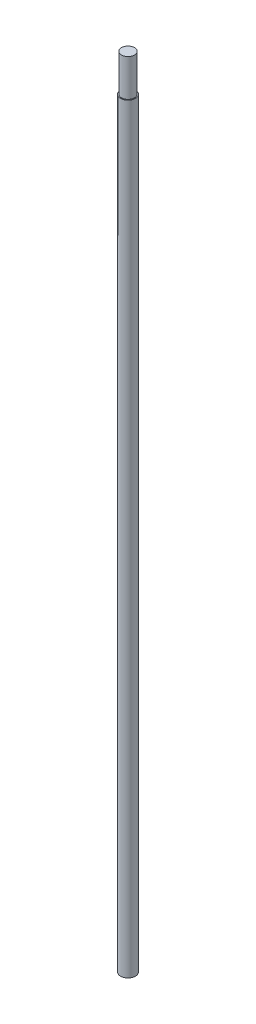
ISO-10303-21;
HEADER;
FILE_DESCRIPTION(('STEP AP214'),'2;1');
FILE_NAME('part.step','',(''),(''),'','','');
FILE_SCHEMA(('AUTOMOTIVE_DESIGN { 1 0 10303 214 1 1 1 1 }'));
ENDSEC;
DATA;
#1=APPLICATION_CONTEXT('core data for automotive mechanical design processes');
#2=APPLICATION_PROTOCOL_DEFINITION('international standard','automotive_design',2000,#1);
#3=PRODUCT_CONTEXT('',#1,'mechanical');
#4=PRODUCT('Part','Part','',(#3));
#5=PRODUCT_RELATED_PRODUCT_CATEGORY('part','',(#4));
#6=PRODUCT_DEFINITION_FORMATION('','',#4);
#7=PRODUCT_DEFINITION_CONTEXT('part definition',#1,'design');
#8=PRODUCT_DEFINITION('design','',#6,#7);
#9=PRODUCT_DEFINITION_SHAPE('','',#8);
#10=(LENGTH_UNIT() NAMED_UNIT(*) SI_UNIT(.MILLI.,.METRE.));
#11=(NAMED_UNIT(*) PLANE_ANGLE_UNIT() SI_UNIT($,.RADIAN.));
#12=(NAMED_UNIT(*) SI_UNIT($,.STERADIAN.) SOLID_ANGLE_UNIT());
#13=UNCERTAINTY_MEASURE_WITH_UNIT(LENGTH_MEASURE(1.E-05),#10,'distance_accuracy_value','');
#14=(GEOMETRIC_REPRESENTATION_CONTEXT(3) GLOBAL_UNCERTAINTY_ASSIGNED_CONTEXT((#13)) GLOBAL_UNIT_ASSIGNED_CONTEXT((#10,
#11,#12)) REPRESENTATION_CONTEXT('',''));
#15=CARTESIAN_POINT('',(0.,0.,0.));
#16=DIRECTION('',(0.,0.,1.));
#17=DIRECTION('',(1.,0.,0.));
#18=AXIS2_PLACEMENT_3D('',#15,#16,#17);
#19=CARTESIAN_POINT('',(0.,410.,0.));
#20=DIRECTION('',(0.,-1.,0.));
#21=DIRECTION('',(0.,0.,-1.));
#22=AXIS2_PLACEMENT_3D('',#19,#20,#21);
#23=CYLINDRICAL_SURFACE('',#22,4.);
#24=CARTESIAN_POINT('',(0.,410.,0.));
#25=DIRECTION('',(0.,1.,0.));
#26=DIRECTION('',(0.,0.,1.));
#27=AXIS2_PLACEMENT_3D('',#24,#25,#26);
#28=CIRCLE('',#27,4.);
#29=CARTESIAN_POINT('',(0.,410.,-4.));
#30=VERTEX_POINT('',#29);
#31=EDGE_CURVE('E44',#30,#30,#28,.T.);
#32=CARTESIAN_POINT('',(0.,0.,0.));
#33=DIRECTION('',(0.,1.,0.));
#34=DIRECTION('',(0.,0.,1.));
#35=AXIS2_PLACEMENT_3D('',#32,#33,#34);
#36=CIRCLE('',#35,4.);
#37=CARTESIAN_POINT('',(0.,0.,-4.));
#38=VERTEX_POINT('',#37);
#39=EDGE_CURVE('E40',#38,#38,#36,.T.);
#40=CARTESIAN_POINT('',(0.,410.,-4.));
#41=CARTESIAN_POINT('',(0.,405.729166666667,-4.));
#42=CARTESIAN_POINT('',(0.,401.458333333333,-4.));
#43=CARTESIAN_POINT('',(0.,392.916666666667,-4.));
#44=CARTESIAN_POINT('',(0.,388.645833333333,-4.));
#45=CARTESIAN_POINT('',(0.,380.104166666667,-4.));
#46=CARTESIAN_POINT('',(0.,375.833333333333,-4.));
#47=CARTESIAN_POINT('',(0.,367.291666666667,-4.));
#48=CARTESIAN_POINT('',(0.,363.020833333333,-4.));
#49=CARTESIAN_POINT('',(0.,354.479166666667,-4.));
#50=CARTESIAN_POINT('',(0.,350.208333333333,-4.));
#51=CARTESIAN_POINT('',(0.,341.666666666667,-4.));
#52=CARTESIAN_POINT('',(0.,337.395833333333,-4.));
#53=CARTESIAN_POINT('',(0.,328.854166666667,-4.));
#54=CARTESIAN_POINT('',(0.,324.583333333333,-4.));
#55=CARTESIAN_POINT('',(0.,316.041666666667,-4.));
#56=CARTESIAN_POINT('',(0.,311.770833333333,-4.));
#57=CARTESIAN_POINT('',(0.,303.229166666667,-4.));
#58=CARTESIAN_POINT('',(0.,298.958333333333,-4.));
#59=CARTESIAN_POINT('',(0.,290.416666666667,-4.));
#60=CARTESIAN_POINT('',(0.,286.145833333333,-4.));
#61=CARTESIAN_POINT('',(0.,277.604166666667,-4.));
#62=CARTESIAN_POINT('',(0.,273.333333333333,-4.));
#63=CARTESIAN_POINT('',(0.,264.791666666667,-4.));
#64=CARTESIAN_POINT('',(0.,260.520833333333,-4.));
#65=CARTESIAN_POINT('',(0.,251.979166666667,-4.));
#66=CARTESIAN_POINT('',(0.,247.708333333333,-4.));
#67=CARTESIAN_POINT('',(0.,239.166666666667,-4.));
#68=CARTESIAN_POINT('',(0.,234.895833333333,-4.));
#69=CARTESIAN_POINT('',(0.,226.354166666667,-4.));
#70=CARTESIAN_POINT('',(0.,222.083333333333,-4.));
#71=CARTESIAN_POINT('',(0.,213.541666666667,-4.));
#72=CARTESIAN_POINT('',(0.,209.270833333333,-4.));
#73=CARTESIAN_POINT('',(0.,200.729166666667,-4.));
#74=CARTESIAN_POINT('',(0.,196.458333333333,-4.));
#75=CARTESIAN_POINT('',(0.,187.916666666667,-4.));
#76=CARTESIAN_POINT('',(0.,183.645833333333,-4.));
#77=CARTESIAN_POINT('',(0.,175.104166666667,-4.));
#78=CARTESIAN_POINT('',(0.,170.833333333333,-4.));
#79=CARTESIAN_POINT('',(0.,162.291666666667,-4.));
#80=CARTESIAN_POINT('',(0.,158.020833333333,-4.));
#81=CARTESIAN_POINT('',(0.,149.479166666667,-4.));
#82=CARTESIAN_POINT('',(0.,145.208333333333,-4.));
#83=CARTESIAN_POINT('',(0.,136.666666666667,-4.));
#84=CARTESIAN_POINT('',(0.,132.395833333333,-4.));
#85=CARTESIAN_POINT('',(0.,123.854166666667,-4.));
#86=CARTESIAN_POINT('',(0.,119.583333333333,-4.));
#87=CARTESIAN_POINT('',(0.,111.041666666667,-4.));
#88=CARTESIAN_POINT('',(0.,106.770833333333,-4.));
#89=CARTESIAN_POINT('',(0.,98.2291666666667,-4.));
#90=CARTESIAN_POINT('',(0.,93.9583333333334,-4.));
#91=CARTESIAN_POINT('',(0.,85.4166666666667,-4.));
#92=CARTESIAN_POINT('',(0.,81.1458333333334,-4.));
#93=CARTESIAN_POINT('',(0.,72.6041666666667,-4.));
#94=CARTESIAN_POINT('',(0.,68.3333333333334,-4.));
#95=CARTESIAN_POINT('',(0.,59.7916666666667,-4.));
#96=CARTESIAN_POINT('',(0.,55.5208333333333,-4.));
#97=CARTESIAN_POINT('',(0.,46.9791666666667,-4.));
#98=CARTESIAN_POINT('',(0.,42.7083333333333,-4.));
#99=CARTESIAN_POINT('',(0.,34.1666666666667,-4.));
#100=CARTESIAN_POINT('',(0.,29.8958333333333,-4.));
#101=CARTESIAN_POINT('',(0.,21.3541666666667,-4.));
#102=CARTESIAN_POINT('',(0.,17.0833333333333,-4.));
#103=CARTESIAN_POINT('',(0.,8.54166666666667,-4.));
#104=CARTESIAN_POINT('',(0.,4.27083333333333,-4.));
#105=CARTESIAN_POINT('',(0.,0.,-4.));
#106=B_SPLINE_CURVE_WITH_KNOTS('',3,(#40,#41,#42,#43,#44,#45,#46,#47,#48,#49,#50,#51,#52,#53,
#54,#55,#56,#57,#58,#59,#60,#61,#62,#63,#64,#65,#66,#67,#68,#69,#70,#71,#72,#73,#74,#75,#76,#77,
#78,#79,#80,#81,#82,#83,#84,#85,#86,#87,#88,#89,#90,#91,#92,#93,#94,#95,#96,#97,#98,#99,#100,
#101,#102,#103,#104,#105),.UNSPECIFIED.,.F.,.F.,(4,2,2,2,2,2,2,2,2,2,2,2,2,2,2,2,2,2,2,2,2,2,2,
2,2,2,2,2,2,2,2,2,4),(0.,12.8125,25.625,38.4375,51.25,64.0625,76.875,89.6875,102.5,115.3125,
128.125,140.9375,153.75,166.5625,179.375,192.1875,205.,217.8125,230.625,243.4375,256.25,
269.0625,281.875,294.6875,307.5,320.3125,333.125,345.9375,358.75,371.5625,384.375,397.1875,
410.),.UNSPECIFIED.);
#107=EDGE_CURVE('BSEAM37',#30,#38,#106,.T.);
#108=ORIENTED_EDGE('',*,*,#31,.F.);
#109=ORIENTED_EDGE('',*,*,#39,.T.);
#110=ORIENTED_EDGE('',*,*,#107,.T.);
#111=ORIENTED_EDGE('',*,*,#107,.F.);
#112=EDGE_LOOP('',(#108,#110,#109,#111));
#113=FACE_BOUND('',#112,.T.);
#114=ADVANCED_FACE('F37',(#113),#23,.T.);
#115=CARTESIAN_POINT('',(0.,410.,0.));
#116=DIRECTION('',(0.,1.,0.));
#117=DIRECTION('',(0.,0.,1.));
#118=AXIS2_PLACEMENT_3D('',#115,#116,#117);
#119=PLANE('',#118);
#120=CARTESIAN_POINT('',(0.,410.,0.));
#121=DIRECTION('',(0.,1.,0.));
#122=DIRECTION('',(0.,0.,1.));
#123=AXIS2_PLACEMENT_3D('',#120,#121,#122);
#124=CIRCLE('',#123,3.5);
#125=CARTESIAN_POINT('',(0.,410.,3.5));
#126=VERTEX_POINT('',#125);
#127=EDGE_CURVE('E10',#126,#126,#124,.T.);
#128=ORIENTED_EDGE('',*,*,#127,.F.);
#129=EDGE_LOOP('',(#128));
#130=FACE_BOUND('',#129,.T.);
#131=ORIENTED_EDGE('',*,*,#31,.T.);
#132=EDGE_LOOP('',(#131));
#133=FACE_BOUND('',#132,.T.);
#134=ADVANCED_FACE('F61',(#130,#133),#119,.T.);
#135=CARTESIAN_POINT('',(0.,0.,0.));
#136=DIRECTION('',(0.,1.,0.));
#137=DIRECTION('',(0.,0.,1.));
#138=AXIS2_PLACEMENT_3D('',#135,#136,#137);
#139=PLANE('',#138);
#140=ORIENTED_EDGE('',*,*,#39,.F.);
#141=EDGE_LOOP('',(#140));
#142=FACE_BOUND('',#141,.T.);
#143=ADVANCED_FACE('F58',(#142),#139,.F.);
#144=CARTESIAN_POINT('',(0.,430.,0.));
#145=DIRECTION('',(0.,-1.,0.));
#146=DIRECTION('',(0.,0.,-1.));
#147=AXIS2_PLACEMENT_3D('',#144,#145,#146);
#148=CYLINDRICAL_SURFACE('',#147,3.5);
#149=CARTESIAN_POINT('',(0.,430.,0.));
#150=DIRECTION('',(0.,1.,0.));
#151=DIRECTION('',(0.,0.,1.));
#152=AXIS2_PLACEMENT_3D('',#149,#150,#151);
#153=CIRCLE('',#152,3.5);
#154=CARTESIAN_POINT('',(0.,430.,3.5));
#155=VERTEX_POINT('',#154);
#156=EDGE_CURVE('E50',#155,#155,#153,.T.);
#157=ORIENTED_EDGE('',*,*,#156,.F.);
#158=EDGE_LOOP('',(#157));
#159=FACE_BOUND('',#158,.T.);
#160=ORIENTED_EDGE('',*,*,#127,.T.);
#161=EDGE_LOOP('',(#160));
#162=FACE_BOUND('',#161,.T.);
#163=ADVANCED_FACE('F60',(#159,#162),#148,.T.);
#164=CARTESIAN_POINT('',(0.,430.,0.));
#165=DIRECTION('',(0.,1.,0.));
#166=DIRECTION('',(0.,0.,1.));
#167=AXIS2_PLACEMENT_3D('',#164,#165,#166);
#168=PLANE('',#167);
#169=ORIENTED_EDGE('',*,*,#156,.T.);
#170=EDGE_LOOP('',(#169));
#171=FACE_BOUND('',#170,.T.);
#172=ADVANCED_FACE('F66',(#171),#168,.T.);
#173=CLOSED_SHELL('',(#114,#134,#143,#163,#172));
#174=MANIFOLD_SOLID_BREP('B2',#173);
#175=ADVANCED_BREP_SHAPE_REPRESENTATION('',(#18,#174),#14);
#176=SHAPE_DEFINITION_REPRESENTATION(#9,#175);
ENDSEC;
END-ISO-10303-21;
